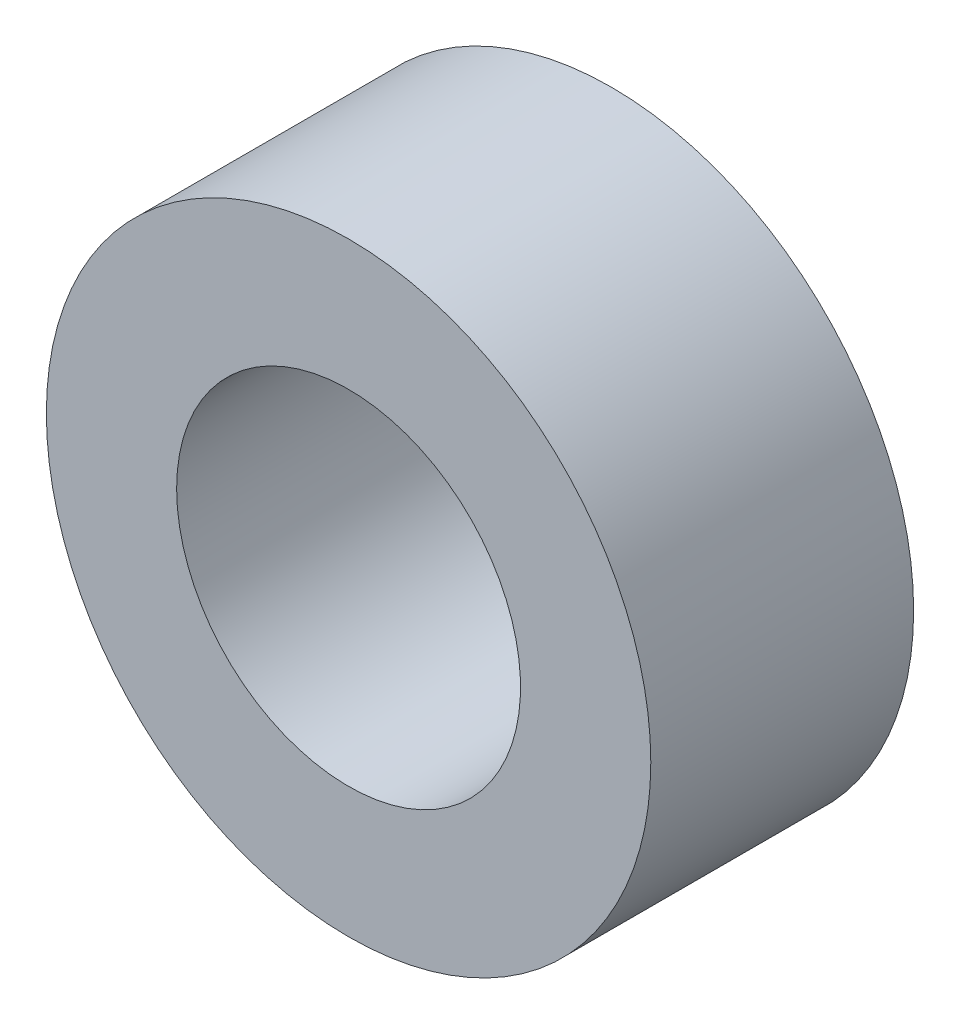
ISO-10303-21;
HEADER;
FILE_DESCRIPTION(('STEP AP214'),'2;1');
FILE_NAME('part.step','',(''),(''),'','','');
FILE_SCHEMA(('AUTOMOTIVE_DESIGN { 1 0 10303 214 1 1 1 1 }'));
ENDSEC;
DATA;
#1=APPLICATION_CONTEXT('core data for automotive mechanical design processes');
#2=APPLICATION_PROTOCOL_DEFINITION('international standard','automotive_design',2000,#1);
#3=PRODUCT_CONTEXT('',#1,'mechanical');
#4=PRODUCT('Part','Part','',(#3));
#5=PRODUCT_RELATED_PRODUCT_CATEGORY('part','',(#4));
#6=PRODUCT_DEFINITION_FORMATION('','',#4);
#7=PRODUCT_DEFINITION_CONTEXT('part definition',#1,'design');
#8=PRODUCT_DEFINITION('design','',#6,#7);
#9=PRODUCT_DEFINITION_SHAPE('','',#8);
#10=(LENGTH_UNIT() NAMED_UNIT(*) SI_UNIT(.MILLI.,.METRE.));
#11=(NAMED_UNIT(*) PLANE_ANGLE_UNIT() SI_UNIT($,.RADIAN.));
#12=(NAMED_UNIT(*) SI_UNIT($,.STERADIAN.) SOLID_ANGLE_UNIT());
#13=UNCERTAINTY_MEASURE_WITH_UNIT(LENGTH_MEASURE(1.E-05),#10,'distance_accuracy_value','');
#14=(GEOMETRIC_REPRESENTATION_CONTEXT(3) GLOBAL_UNCERTAINTY_ASSIGNED_CONTEXT((#13)) GLOBAL_UNIT_ASSIGNED_CONTEXT((#10,
#11,#12)) REPRESENTATION_CONTEXT('',''));
#15=CARTESIAN_POINT('',(0.,0.,0.));
#16=DIRECTION('',(0.,0.,1.));
#17=DIRECTION('',(1.,0.,0.));
#18=AXIS2_PLACEMENT_3D('',#15,#16,#17);
#19=CARTESIAN_POINT('',(0.,0.,6.40625));
#20=DIRECTION('',(0.,0.,1.));
#21=DIRECTION('',(1.,0.,0.));
#22=AXIS2_PLACEMENT_3D('',#19,#20,#21);
#23=PLANE('',#22);
#24=CARTESIAN_POINT('',(0.,0.,6.40625));
#25=DIRECTION('',(0.,0.,1.));
#26=DIRECTION('',(1.,0.,0.));
#27=AXIS2_PLACEMENT_3D('',#24,#25,#26);
#28=CIRCLE('',#27,7.366);
#29=CARTESIAN_POINT('',(-7.366,0.,6.40625));
#30=VERTEX_POINT('',#29);
#31=EDGE_CURVE('E10',#30,#30,#28,.T.);
#32=ORIENTED_EDGE('',*,*,#31,.T.);
#33=EDGE_LOOP('',(#32));
#34=FACE_BOUND('',#33,.T.);
#35=CARTESIAN_POINT('',(0.,0.,6.40625));
#36=DIRECTION('',(0.,0.,1.));
#37=DIRECTION('',(1.,0.,0.));
#38=AXIS2_PLACEMENT_3D('',#35,#36,#37);
#39=CIRCLE('',#38,4.191);
#40=CARTESIAN_POINT('',(-4.191,0.,6.40625));
#41=VERTEX_POINT('',#40);
#42=EDGE_CURVE('E48',#41,#41,#39,.T.);
#43=ORIENTED_EDGE('',*,*,#42,.F.);
#44=EDGE_LOOP('',(#43));
#45=FACE_BOUND('',#44,.T.);
#46=ADVANCED_FACE('F37',(#34,#45),#23,.T.);
#47=CARTESIAN_POINT('',(0.,0.,0.));
#48=DIRECTION('',(0.,0.,1.));
#49=DIRECTION('',(1.,0.,0.));
#50=AXIS2_PLACEMENT_3D('',#47,#48,#49);
#51=PLANE('',#50);
#52=CARTESIAN_POINT('',(0.,0.,0.));
#53=DIRECTION('',(0.,0.,1.));
#54=DIRECTION('',(1.,0.,0.));
#55=AXIS2_PLACEMENT_3D('',#52,#53,#54);
#56=CIRCLE('',#55,7.366);
#57=CARTESIAN_POINT('',(-7.366,0.,0.));
#58=VERTEX_POINT('',#57);
#59=EDGE_CURVE('E41',#58,#58,#56,.T.);
#60=ORIENTED_EDGE('',*,*,#59,.F.);
#61=EDGE_LOOP('',(#60));
#62=FACE_BOUND('',#61,.T.);
#63=CARTESIAN_POINT('',(0.,0.,0.));
#64=DIRECTION('',(0.,0.,1.));
#65=DIRECTION('',(1.,0.,0.));
#66=AXIS2_PLACEMENT_3D('',#63,#64,#65);
#67=CIRCLE('',#66,4.191);
#68=CARTESIAN_POINT('',(-4.191,0.,0.));
#69=VERTEX_POINT('',#68);
#70=EDGE_CURVE('E50',#69,#69,#67,.T.);
#71=ORIENTED_EDGE('',*,*,#70,.T.);
#72=EDGE_LOOP('',(#71));
#73=FACE_BOUND('',#72,.T.);
#74=ADVANCED_FACE('F60',(#62,#73),#51,.F.);
#75=CARTESIAN_POINT('',(0.,0.,6.40625));
#76=DIRECTION('',(0.,0.,-1.));
#77=DIRECTION('',(-1.,0.,0.));
#78=AXIS2_PLACEMENT_3D('',#75,#76,#77);
#79=CYLINDRICAL_SURFACE('',#78,7.366);
#80=CARTESIAN_POINT('',(-7.366,0.,6.40625));
#81=CARTESIAN_POINT('',(-7.366,0.,6.33951822916667));
#82=CARTESIAN_POINT('',(-7.366,0.,6.27278645833333));
#83=CARTESIAN_POINT('',(-7.366,0.,6.13932291666667));
#84=CARTESIAN_POINT('',(-7.366,0.,6.07259114583333));
#85=CARTESIAN_POINT('',(-7.366,0.,5.93912760416667));
#86=CARTESIAN_POINT('',(-7.366,0.,5.87239583333333));
#87=CARTESIAN_POINT('',(-7.366,0.,5.73893229166667));
#88=CARTESIAN_POINT('',(-7.366,0.,5.67220052083333));
#89=CARTESIAN_POINT('',(-7.366,0.,5.53873697916667));
#90=CARTESIAN_POINT('',(-7.366,0.,5.47200520833333));
#91=CARTESIAN_POINT('',(-7.366,0.,5.33854166666667));
#92=CARTESIAN_POINT('',(-7.366,0.,5.27180989583333));
#93=CARTESIAN_POINT('',(-7.366,0.,5.13834635416667));
#94=CARTESIAN_POINT('',(-7.366,0.,5.07161458333333));
#95=CARTESIAN_POINT('',(-7.366,0.,4.93815104166667));
#96=CARTESIAN_POINT('',(-7.366,0.,4.87141927083333));
#97=CARTESIAN_POINT('',(-7.366,0.,4.73795572916667));
#98=CARTESIAN_POINT('',(-7.366,0.,4.67122395833333));
#99=CARTESIAN_POINT('',(-7.366,0.,4.53776041666667));
#100=CARTESIAN_POINT('',(-7.366,0.,4.47102864583333));
#101=CARTESIAN_POINT('',(-7.366,0.,4.33756510416667));
#102=CARTESIAN_POINT('',(-7.366,0.,4.27083333333333));
#103=CARTESIAN_POINT('',(-7.366,0.,4.13736979166667));
#104=CARTESIAN_POINT('',(-7.366,0.,4.07063802083333));
#105=CARTESIAN_POINT('',(-7.366,0.,3.93717447916667));
#106=CARTESIAN_POINT('',(-7.366,0.,3.87044270833333));
#107=CARTESIAN_POINT('',(-7.366,0.,3.73697916666667));
#108=CARTESIAN_POINT('',(-7.366,0.,3.67024739583333));
#109=CARTESIAN_POINT('',(-7.366,0.,3.53678385416667));
#110=CARTESIAN_POINT('',(-7.366,0.,3.47005208333333));
#111=CARTESIAN_POINT('',(-7.366,0.,3.33658854166667));
#112=CARTESIAN_POINT('',(-7.366,0.,3.26985677083333));
#113=CARTESIAN_POINT('',(-7.366,0.,3.13639322916667));
#114=CARTESIAN_POINT('',(-7.366,0.,3.06966145833333));
#115=CARTESIAN_POINT('',(-7.366,0.,2.93619791666667));
#116=CARTESIAN_POINT('',(-7.366,0.,2.86946614583333));
#117=CARTESIAN_POINT('',(-7.366,0.,2.73600260416667));
#118=CARTESIAN_POINT('',(-7.366,0.,2.66927083333333));
#119=CARTESIAN_POINT('',(-7.366,0.,2.53580729166667));
#120=CARTESIAN_POINT('',(-7.366,0.,2.46907552083333));
#121=CARTESIAN_POINT('',(-7.366,0.,2.33561197916667));
#122=CARTESIAN_POINT('',(-7.366,0.,2.26888020833333));
#123=CARTESIAN_POINT('',(-7.366,0.,2.13541666666667));
#124=CARTESIAN_POINT('',(-7.366,0.,2.06868489583333));
#125=CARTESIAN_POINT('',(-7.366,0.,1.93522135416667));
#126=CARTESIAN_POINT('',(-7.366,0.,1.86848958333333));
#127=CARTESIAN_POINT('',(-7.366,0.,1.73502604166667));
#128=CARTESIAN_POINT('',(-7.366,0.,1.66829427083333));
#129=CARTESIAN_POINT('',(-7.366,0.,1.53483072916667));
#130=CARTESIAN_POINT('',(-7.366,0.,1.46809895833333));
#131=CARTESIAN_POINT('',(-7.366,0.,1.33463541666667));
#132=CARTESIAN_POINT('',(-7.366,0.,1.26790364583333));
#133=CARTESIAN_POINT('',(-7.366,0.,1.13444010416667));
#134=CARTESIAN_POINT('',(-7.366,0.,1.06770833333333));
#135=CARTESIAN_POINT('',(-7.366,0.,0.934244791666667));
#136=CARTESIAN_POINT('',(-7.366,0.,0.867513020833334));
#137=CARTESIAN_POINT('',(-7.366,0.,0.734049479166667));
#138=CARTESIAN_POINT('',(-7.366,0.,0.667317708333334));
#139=CARTESIAN_POINT('',(-7.366,0.,0.533854166666667));
#140=CARTESIAN_POINT('',(-7.366,0.,0.467122395833333));
#141=CARTESIAN_POINT('',(-7.366,0.,0.333658854166667));
#142=CARTESIAN_POINT('',(-7.366,0.,0.266927083333333));
#143=CARTESIAN_POINT('',(-7.366,0.,0.133463541666667));
#144=CARTESIAN_POINT('',(-7.366,0.,0.0667317708333333));
#145=CARTESIAN_POINT('',(-7.366,0.,0.));
#146=B_SPLINE_CURVE_WITH_KNOTS('',3,(#80,#81,#82,#83,#84,#85,#86,#87,#88,#89,#90,#91,#92,#93,
#94,#95,#96,#97,#98,#99,#100,#101,#102,#103,#104,#105,#106,#107,#108,#109,#110,#111,#112,#113,
#114,#115,#116,#117,#118,#119,#120,#121,#122,#123,#124,#125,#126,#127,#128,#129,#130,#131,#132,
#133,#134,#135,#136,#137,#138,#139,#140,#141,#142,#143,#144,#145),.UNSPECIFIED.,.F.,.F.,(4,2,2,
2,2,2,2,2,2,2,2,2,2,2,2,2,2,2,2,2,2,2,2,2,2,2,2,2,2,2,2,2,4),(0.,0.2001953125,0.400390625,
0.6005859375,0.80078125,1.0009765625,1.201171875,1.4013671875,1.6015625,1.8017578125,
2.001953125,2.2021484375,2.40234375,2.6025390625,2.802734375,3.0029296875,3.203125,3.4033203125,
3.603515625,3.8037109375,4.00390625,4.2041015625,4.404296875,4.6044921875,4.8046875,
5.0048828125,5.205078125,5.4052734375,5.60546875,5.8056640625,6.005859375,6.2060546875,6.40625),.UNSPECIFIED.);
#147=EDGE_CURVE('BSEAM39',#30,#58,#146,.T.);
#148=ORIENTED_EDGE('',*,*,#31,.F.);
#149=ORIENTED_EDGE('',*,*,#59,.T.);
#150=ORIENTED_EDGE('',*,*,#147,.T.);
#151=ORIENTED_EDGE('',*,*,#147,.F.);
#152=EDGE_LOOP('',(#148,#150,#149,#151));
#153=FACE_BOUND('',#152,.T.);
#154=ADVANCED_FACE('F39',(#153),#79,.T.);
#155=CARTESIAN_POINT('',(0.,0.,6.40625));
#156=DIRECTION('',(0.,0.,-1.));
#157=DIRECTION('',(-1.,0.,0.));
#158=AXIS2_PLACEMENT_3D('',#155,#156,#157);
#159=CYLINDRICAL_SURFACE('',#158,4.191);
#160=CARTESIAN_POINT('',(-4.191,0.,6.40625));
#161=CARTESIAN_POINT('',(-4.191,0.,6.33951822916667));
#162=CARTESIAN_POINT('',(-4.191,0.,6.27278645833333));
#163=CARTESIAN_POINT('',(-4.191,0.,6.13932291666667));
#164=CARTESIAN_POINT('',(-4.191,0.,6.07259114583333));
#165=CARTESIAN_POINT('',(-4.191,0.,5.93912760416667));
#166=CARTESIAN_POINT('',(-4.191,0.,5.87239583333333));
#167=CARTESIAN_POINT('',(-4.191,0.,5.73893229166667));
#168=CARTESIAN_POINT('',(-4.191,0.,5.67220052083333));
#169=CARTESIAN_POINT('',(-4.191,0.,5.53873697916667));
#170=CARTESIAN_POINT('',(-4.191,0.,5.47200520833333));
#171=CARTESIAN_POINT('',(-4.191,0.,5.33854166666667));
#172=CARTESIAN_POINT('',(-4.191,0.,5.27180989583333));
#173=CARTESIAN_POINT('',(-4.191,0.,5.13834635416667));
#174=CARTESIAN_POINT('',(-4.191,0.,5.07161458333333));
#175=CARTESIAN_POINT('',(-4.191,0.,4.93815104166667));
#176=CARTESIAN_POINT('',(-4.191,0.,4.87141927083333));
#177=CARTESIAN_POINT('',(-4.191,0.,4.73795572916667));
#178=CARTESIAN_POINT('',(-4.191,0.,4.67122395833333));
#179=CARTESIAN_POINT('',(-4.191,0.,4.53776041666667));
#180=CARTESIAN_POINT('',(-4.191,0.,4.47102864583333));
#181=CARTESIAN_POINT('',(-4.191,0.,4.33756510416667));
#182=CARTESIAN_POINT('',(-4.191,0.,4.27083333333333));
#183=CARTESIAN_POINT('',(-4.191,0.,4.13736979166667));
#184=CARTESIAN_POINT('',(-4.191,0.,4.07063802083333));
#185=CARTESIAN_POINT('',(-4.191,0.,3.93717447916667));
#186=CARTESIAN_POINT('',(-4.191,0.,3.87044270833333));
#187=CARTESIAN_POINT('',(-4.191,0.,3.73697916666667));
#188=CARTESIAN_POINT('',(-4.191,0.,3.67024739583333));
#189=CARTESIAN_POINT('',(-4.191,0.,3.53678385416667));
#190=CARTESIAN_POINT('',(-4.191,0.,3.47005208333333));
#191=CARTESIAN_POINT('',(-4.191,0.,3.33658854166667));
#192=CARTESIAN_POINT('',(-4.191,0.,3.26985677083333));
#193=CARTESIAN_POINT('',(-4.191,0.,3.13639322916667));
#194=CARTESIAN_POINT('',(-4.191,0.,3.06966145833333));
#195=CARTESIAN_POINT('',(-4.191,0.,2.93619791666667));
#196=CARTESIAN_POINT('',(-4.191,0.,2.86946614583333));
#197=CARTESIAN_POINT('',(-4.191,0.,2.73600260416667));
#198=CARTESIAN_POINT('',(-4.191,0.,2.66927083333333));
#199=CARTESIAN_POINT('',(-4.191,0.,2.53580729166667));
#200=CARTESIAN_POINT('',(-4.191,0.,2.46907552083333));
#201=CARTESIAN_POINT('',(-4.191,0.,2.33561197916667));
#202=CARTESIAN_POINT('',(-4.191,0.,2.26888020833333));
#203=CARTESIAN_POINT('',(-4.191,0.,2.13541666666667));
#204=CARTESIAN_POINT('',(-4.191,0.,2.06868489583333));
#205=CARTESIAN_POINT('',(-4.191,0.,1.93522135416667));
#206=CARTESIAN_POINT('',(-4.191,0.,1.86848958333333));
#207=CARTESIAN_POINT('',(-4.191,0.,1.73502604166667));
#208=CARTESIAN_POINT('',(-4.191,0.,1.66829427083333));
#209=CARTESIAN_POINT('',(-4.191,0.,1.53483072916667));
#210=CARTESIAN_POINT('',(-4.191,0.,1.46809895833333));
#211=CARTESIAN_POINT('',(-4.191,0.,1.33463541666667));
#212=CARTESIAN_POINT('',(-4.191,0.,1.26790364583333));
#213=CARTESIAN_POINT('',(-4.191,0.,1.13444010416667));
#214=CARTESIAN_POINT('',(-4.191,0.,1.06770833333333));
#215=CARTESIAN_POINT('',(-4.191,0.,0.934244791666667));
#216=CARTESIAN_POINT('',(-4.191,0.,0.867513020833334));
#217=CARTESIAN_POINT('',(-4.191,0.,0.734049479166667));
#218=CARTESIAN_POINT('',(-4.191,0.,0.667317708333334));
#219=CARTESIAN_POINT('',(-4.191,0.,0.533854166666667));
#220=CARTESIAN_POINT('',(-4.191,0.,0.467122395833333));
#221=CARTESIAN_POINT('',(-4.191,0.,0.333658854166667));
#222=CARTESIAN_POINT('',(-4.191,0.,0.266927083333333));
#223=CARTESIAN_POINT('',(-4.191,0.,0.133463541666667));
#224=CARTESIAN_POINT('',(-4.191,0.,0.0667317708333333));
#225=CARTESIAN_POINT('',(-4.191,0.,0.));
#226=B_SPLINE_CURVE_WITH_KNOTS('',3,(#160,#161,#162,#163,#164,#165,#166,#167,#168,#169,#170,
#171,#172,#173,#174,#175,#176,#177,#178,#179,#180,#181,#182,#183,#184,#185,#186,#187,#188,#189,
#190,#191,#192,#193,#194,#195,#196,#197,#198,#199,#200,#201,#202,#203,#204,#205,#206,#207,#208,
#209,#210,#211,#212,#213,#214,#215,#216,#217,#218,#219,#220,#221,#222,#223,#224,#225),
.UNSPECIFIED.,.F.,.F.,(4,2,2,2,2,2,2,2,2,2,2,2,2,2,2,2,2,2,2,2,2,2,2,2,2,2,2,2,2,2,2,2,4),(0.,
0.2001953125,0.400390625,0.6005859375,0.80078125,1.0009765625,1.201171875,1.4013671875,
1.6015625,1.8017578125,2.001953125,2.2021484375,2.40234375,2.6025390625,2.802734375,
3.0029296875,3.203125,3.4033203125,3.603515625,3.8037109375,4.00390625,4.2041015625,4.404296875,
4.6044921875,4.8046875,5.0048828125,5.205078125,5.4052734375,5.60546875,5.8056640625,
6.005859375,6.2060546875,6.40625),.UNSPECIFIED.);
#227=EDGE_CURVE('BSEAM56',#41,#69,#226,.T.);
#228=ORIENTED_EDGE('',*,*,#42,.T.);
#229=ORIENTED_EDGE('',*,*,#70,.F.);
#230=ORIENTED_EDGE('',*,*,#227,.T.);
#231=ORIENTED_EDGE('',*,*,#227,.F.);
#232=EDGE_LOOP('',(#228,#230,#229,#231));
#233=FACE_BOUND('',#232,.T.);
#234=ADVANCED_FACE('F56',(#233),#159,.F.);
#235=CLOSED_SHELL('',(#46,#74,#154,#234));
#236=MANIFOLD_SOLID_BREP('B2',#235);
#237=ADVANCED_BREP_SHAPE_REPRESENTATION('',(#18,#236),#14);
#238=SHAPE_DEFINITION_REPRESENTATION(#9,#237);
ENDSEC;
END-ISO-10303-21;
